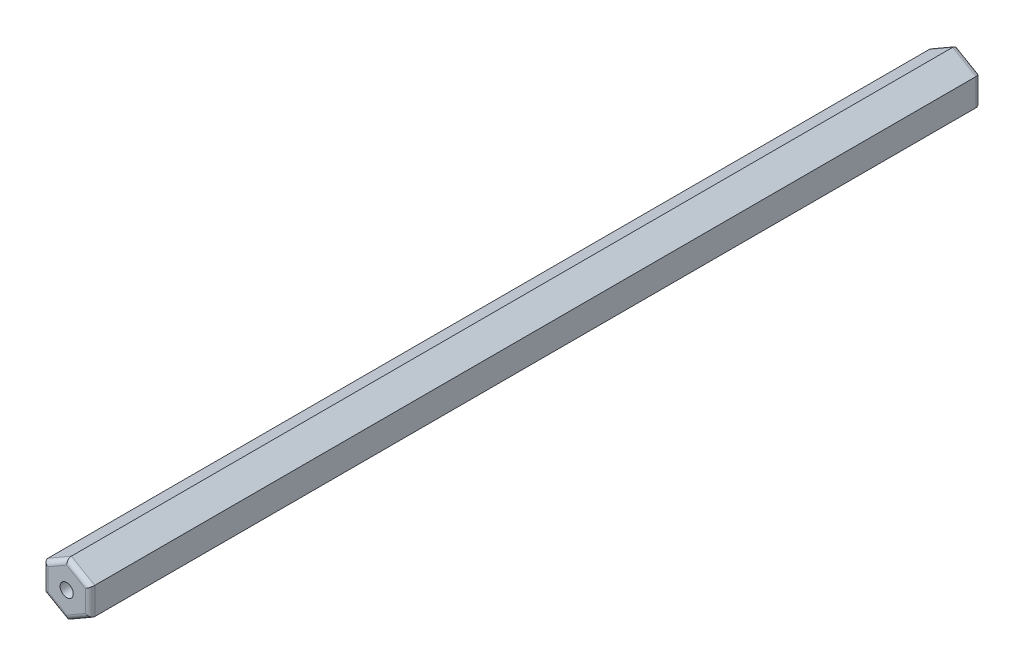
ISO-10303-21;
HEADER;
FILE_DESCRIPTION(('STEP AP214'),'2;1');
FILE_NAME('part.step','',(''),(''),'','','');
FILE_SCHEMA(('AUTOMOTIVE_DESIGN { 1 0 10303 214 1 1 1 1 }'));
ENDSEC;
DATA;
#1=APPLICATION_CONTEXT('core data for automotive mechanical design processes');
#2=APPLICATION_PROTOCOL_DEFINITION('international standard','automotive_design',2000,#1);
#3=PRODUCT_CONTEXT('',#1,'mechanical');
#4=PRODUCT('Part','Part','',(#3));
#5=PRODUCT_RELATED_PRODUCT_CATEGORY('part','',(#4));
#6=PRODUCT_DEFINITION_FORMATION('','',#4);
#7=PRODUCT_DEFINITION_CONTEXT('part definition',#1,'design');
#8=PRODUCT_DEFINITION('design','',#6,#7);
#9=PRODUCT_DEFINITION_SHAPE('','',#8);
#10=(LENGTH_UNIT() NAMED_UNIT(*) SI_UNIT(.MILLI.,.METRE.));
#11=(NAMED_UNIT(*) PLANE_ANGLE_UNIT() SI_UNIT($,.RADIAN.));
#12=(NAMED_UNIT(*) SI_UNIT($,.STERADIAN.) SOLID_ANGLE_UNIT());
#13=UNCERTAINTY_MEASURE_WITH_UNIT(LENGTH_MEASURE(1.E-05),#10,'distance_accuracy_value','');
#14=(GEOMETRIC_REPRESENTATION_CONTEXT(3) GLOBAL_UNCERTAINTY_ASSIGNED_CONTEXT((#13)) GLOBAL_UNIT_ASSIGNED_CONTEXT((#10,
#11,#12)) REPRESENTATION_CONTEXT('',''));
#15=CARTESIAN_POINT('',(0.,0.,0.));
#16=DIRECTION('',(0.,0.,1.));
#17=DIRECTION('',(1.,0.,0.));
#18=AXIS2_PLACEMENT_3D('',#15,#16,#17);
#19=CARTESIAN_POINT('',(-52.50212267549,1.44337567297407,40.));
#20=DIRECTION('',(0.5,0.866025403784439,0.));
#21=DIRECTION('',(-0.866025403784439,0.5,0.));
#22=AXIS2_PLACEMENT_3D('',#19,#20,#21);
#23=PLANE('',#22);
#24=DIRECTION('',(0.,0.,1.));
#25=VECTOR('',#24,1.);
#26=CARTESIAN_POINT('',(-55.00212267549,2.88675134594813,40.));
#27=LINE('',#26,#25);
#28=CARTESIAN_POINT('',(-55.00212267549,2.88675134594813,40.5));
#29=VERTEX_POINT('',#28);
#30=CARTESIAN_POINT('',(-55.00212267549,2.88675134594813,134.5));
#31=VERTEX_POINT('',#30);
#32=EDGE_CURVE('E157',#29,#31,#27,.T.);
#33=ORIENTED_EDGE('',*,*,#32,.T.);
#34=DIRECTION('',(-0.866025403784439,0.5,0.));
#35=VECTOR('',#34,1.);
#36=CARTESIAN_POINT('',(-52.50212267549,1.44337567297407,134.5));
#37=LINE('',#36,#35);
#38=CARTESIAN_POINT('',(-52.50212267549,1.44337567297407,134.5));
#39=VERTEX_POINT('',#38);
#40=EDGE_CURVE('E154',#31,#39,#37,.F.);
#41=ORIENTED_EDGE('',*,*,#40,.T.);
#42=DIRECTION('',(0.,0.,1.));
#43=VECTOR('',#42,1.);
#44=CARTESIAN_POINT('',(-52.50212267549,1.44337567297407,40.));
#45=LINE('',#44,#43);
#46=CARTESIAN_POINT('',(-52.50212267549,1.44337567297407,40.5));
#47=VERTEX_POINT('',#46);
#48=EDGE_CURVE('E151',#47,#39,#45,.T.);
#49=ORIENTED_EDGE('',*,*,#48,.F.);
#50=DIRECTION('',(-0.866025403784439,0.5,0.));
#51=VECTOR('',#50,1.);
#52=CARTESIAN_POINT('',(-55.00212267549,2.88675134594813,40.5));
#53=LINE('',#52,#51);
#54=EDGE_CURVE('E211',#47,#29,#53,.T.);
#55=ORIENTED_EDGE('',*,*,#54,.T.);
#56=EDGE_LOOP('',(#33,#41,#49,#55));
#57=FACE_BOUND('',#56,.T.);
#58=ADVANCED_FACE('F37',(#57),#23,.T.);
#59=CARTESIAN_POINT('',(-52.50212267549,-1.44337567297408,40.));
#60=DIRECTION('',(1.,0.,0.));
#61=DIRECTION('',(0.,0.,-1.));
#62=AXIS2_PLACEMENT_3D('',#59,#60,#61);
#63=PLANE('',#62);
#64=ORIENTED_EDGE('',*,*,#48,.T.);
#65=DIRECTION('',(0.,1.,0.));
#66=VECTOR('',#65,1.);
#67=CARTESIAN_POINT('',(-52.50212267549,-1.44337567297408,134.5));
#68=LINE('',#67,#66);
#69=CARTESIAN_POINT('',(-52.50212267549,-1.44337567297408,134.5));
#70=VERTEX_POINT('',#69);
#71=EDGE_CURVE('E196',#39,#70,#68,.F.);
#72=ORIENTED_EDGE('',*,*,#71,.T.);
#73=DIRECTION('',(0.,0.,1.));
#74=VECTOR('',#73,1.);
#75=CARTESIAN_POINT('',(-52.50212267549,-1.44337567297408,40.));
#76=LINE('',#75,#74);
#77=CARTESIAN_POINT('',(-52.50212267549,-1.44337567297408,40.5));
#78=VERTEX_POINT('',#77);
#79=EDGE_CURVE('E260',#78,#70,#76,.T.);
#80=ORIENTED_EDGE('',*,*,#79,.F.);
#81=DIRECTION('',(0.,1.,0.));
#82=VECTOR('',#81,1.);
#83=CARTESIAN_POINT('',(-52.50212267549,1.44337567297407,40.5));
#84=LINE('',#83,#82);
#85=EDGE_CURVE('E202',#78,#47,#84,.T.);
#86=ORIENTED_EDGE('',*,*,#85,.T.);
#87=EDGE_LOOP('',(#64,#72,#80,#86));
#88=FACE_BOUND('',#87,.T.);
#89=ADVANCED_FACE('F289',(#88),#63,.T.);
#90=CARTESIAN_POINT('',(-55.00212267549,-2.88675134594813,40.));
#91=DIRECTION('',(0.5,-0.866025403784439,0.));
#92=DIRECTION('',(0.866025403784439,0.5,0.));
#93=AXIS2_PLACEMENT_3D('',#90,#91,#92);
#94=PLANE('',#93);
#95=ORIENTED_EDGE('',*,*,#79,.T.);
#96=DIRECTION('',(0.866025403784439,0.5,0.));
#97=VECTOR('',#96,1.);
#98=CARTESIAN_POINT('',(-55.00212267549,-2.88675134594813,134.5));
#99=LINE('',#98,#97);
#100=CARTESIAN_POINT('',(-55.00212267549,-2.88675134594813,134.5));
#101=VERTEX_POINT('',#100);
#102=EDGE_CURVE('E236',#70,#101,#99,.F.);
#103=ORIENTED_EDGE('',*,*,#102,.T.);
#104=DIRECTION('',(0.,0.,1.));
#105=VECTOR('',#104,1.);
#106=CARTESIAN_POINT('',(-55.00212267549,-2.88675134594813,40.));
#107=LINE('',#106,#105);
#108=CARTESIAN_POINT('',(-55.00212267549,-2.88675134594813,40.5));
#109=VERTEX_POINT('',#108);
#110=EDGE_CURVE('E258',#109,#101,#107,.T.);
#111=ORIENTED_EDGE('',*,*,#110,.F.);
#112=DIRECTION('',(0.866025403784439,0.5,0.));
#113=VECTOR('',#112,1.);
#114=CARTESIAN_POINT('',(-52.50212267549,-1.44337567297408,40.5));
#115=LINE('',#114,#113);
#116=EDGE_CURVE('E239',#109,#78,#115,.T.);
#117=ORIENTED_EDGE('',*,*,#116,.T.);
#118=EDGE_LOOP('',(#95,#103,#111,#117));
#119=FACE_BOUND('',#118,.T.);
#120=ADVANCED_FACE('F295',(#119),#94,.T.);
#121=CARTESIAN_POINT('',(-57.50212267549,-1.44337567297406,40.));
#122=DIRECTION('',(-0.5,-0.866025403784438,0.));
#123=DIRECTION('',(0.866025403784438,-0.5,0.));
#124=AXIS2_PLACEMENT_3D('',#121,#122,#123);
#125=PLANE('',#124);
#126=ORIENTED_EDGE('',*,*,#110,.T.);
#127=DIRECTION('',(0.866025403784438,-0.5,0.));
#128=VECTOR('',#127,1.);
#129=CARTESIAN_POINT('',(-57.50212267549,-1.44337567297406,134.5));
#130=LINE('',#129,#128);
#131=CARTESIAN_POINT('',(-57.50212267549,-1.44337567297406,134.5));
#132=VERTEX_POINT('',#131);
#133=EDGE_CURVE('E206',#101,#132,#130,.F.);
#134=ORIENTED_EDGE('',*,*,#133,.T.);
#135=DIRECTION('',(0.,0.,1.));
#136=VECTOR('',#135,1.);
#137=CARTESIAN_POINT('',(-57.50212267549,-1.44337567297406,40.));
#138=LINE('',#137,#136);
#139=CARTESIAN_POINT('',(-57.50212267549,-1.44337567297406,40.5));
#140=VERTEX_POINT('',#139);
#141=EDGE_CURVE('E255',#140,#132,#138,.T.);
#142=ORIENTED_EDGE('',*,*,#141,.F.);
#143=DIRECTION('',(0.866025403784438,-0.5,0.));
#144=VECTOR('',#143,1.);
#145=CARTESIAN_POINT('',(-55.00212267549,-2.88675134594813,40.5));
#146=LINE('',#145,#144);
#147=EDGE_CURVE('E231',#140,#109,#146,.T.);
#148=ORIENTED_EDGE('',*,*,#147,.T.);
#149=EDGE_LOOP('',(#126,#134,#142,#148));
#150=FACE_BOUND('',#149,.T.);
#151=ADVANCED_FACE('F344',(#150),#125,.T.);
#152=CARTESIAN_POINT('',(-57.50212267549,1.44337567297406,40.));
#153=DIRECTION('',(-1.,0.,0.));
#154=DIRECTION('',(0.,0.,1.));
#155=AXIS2_PLACEMENT_3D('',#152,#153,#154);
#156=PLANE('',#155);
#157=ORIENTED_EDGE('',*,*,#141,.T.);
#158=DIRECTION('',(0.,-1.,0.));
#159=VECTOR('',#158,1.);
#160=CARTESIAN_POINT('',(-57.50212267549,1.44337567297406,134.5));
#161=LINE('',#160,#159);
#162=CARTESIAN_POINT('',(-57.50212267549,1.44337567297406,134.5));
#163=VERTEX_POINT('',#162);
#164=EDGE_CURVE('E204',#132,#163,#161,.F.);
#165=ORIENTED_EDGE('',*,*,#164,.T.);
#166=DIRECTION('',(0.,0.,1.));
#167=VECTOR('',#166,1.);
#168=CARTESIAN_POINT('',(-57.50212267549,1.44337567297406,40.));
#169=LINE('',#168,#167);
#170=CARTESIAN_POINT('',(-57.50212267549,1.44337567297406,40.5));
#171=VERTEX_POINT('',#170);
#172=EDGE_CURVE('E252',#171,#163,#169,.T.);
#173=ORIENTED_EDGE('',*,*,#172,.F.);
#174=DIRECTION('',(0.,-1.,0.));
#175=VECTOR('',#174,1.);
#176=CARTESIAN_POINT('',(-57.50212267549,-1.44337567297406,40.5));
#177=LINE('',#176,#175);
#178=EDGE_CURVE('E201',#171,#140,#177,.T.);
#179=ORIENTED_EDGE('',*,*,#178,.T.);
#180=EDGE_LOOP('',(#157,#165,#173,#179));
#181=FACE_BOUND('',#180,.T.);
#182=ADVANCED_FACE('F346',(#181),#156,.T.);
#183=CARTESIAN_POINT('',(-55.00212267549,2.88675134594813,40.));
#184=DIRECTION('',(-0.5,0.866025403784439,0.));
#185=DIRECTION('',(-0.866025403784439,-0.5,0.));
#186=AXIS2_PLACEMENT_3D('',#183,#184,#185);
#187=PLANE('',#186);
#188=ORIENTED_EDGE('',*,*,#172,.T.);
#189=DIRECTION('',(-0.866025403784439,-0.5,0.));
#190=VECTOR('',#189,1.);
#191=CARTESIAN_POINT('',(-55.00212267549,2.88675134594813,134.5));
#192=LINE('',#191,#190);
#193=EDGE_CURVE('E216',#163,#31,#192,.F.);
#194=ORIENTED_EDGE('',*,*,#193,.T.);
#195=ORIENTED_EDGE('',*,*,#32,.F.);
#196=DIRECTION('',(-0.866025403784439,-0.5,0.));
#197=VECTOR('',#196,1.);
#198=CARTESIAN_POINT('',(-57.50212267549,1.44337567297406,40.5));
#199=LINE('',#198,#197);
#200=EDGE_CURVE('E214',#29,#171,#199,.T.);
#201=ORIENTED_EDGE('',*,*,#200,.T.);
#202=EDGE_LOOP('',(#188,#194,#195,#201));
#203=FACE_BOUND('',#202,.T.);
#204=ADVANCED_FACE('F285',(#203),#187,.T.);
#205=CARTESIAN_POINT('',(0.,0.,40.));
#206=DIRECTION('',(0.,0.,1.));
#207=DIRECTION('',(1.,0.,0.));
#208=AXIS2_PLACEMENT_3D('',#205,#206,#207);
#209=PLANE('',#208);
#210=CARTESIAN_POINT('',(-55.00212267549,0.,40.));
#211=DIRECTION('',(0.,0.,1.));
#212=DIRECTION('',(1.,0.,0.));
#213=AXIS2_PLACEMENT_3D('',#210,#211,#212);
#214=CIRCLE('',#213,0.701481341004905);
#215=CARTESIAN_POINT('',(-54.3006413344851,0.,40.));
#216=VERTEX_POINT('',#215);
#217=EDGE_CURVE('E166',#216,#216,#214,.T.);
#218=ORIENTED_EDGE('',*,*,#217,.T.);
#219=EDGE_LOOP('',(#218));
#220=FACE_BOUND('',#219,.T.);
#221=DIRECTION('',(0.,1.,0.));
#222=VECTOR('',#221,1.);
#223=CARTESIAN_POINT('',(-53.00212267549,-1.44337567297408,40.));
#224=LINE('',#223,#222);
#225=CARTESIAN_POINT('',(-53.00212267549,1.15470053837925,40.));
#226=VERTEX_POINT('',#225);
#227=CARTESIAN_POINT('',(-53.00212267549,-1.15470053837926,40.));
#228=VERTEX_POINT('',#227);
#229=EDGE_CURVE('E61',#226,#228,#224,.F.);
#230=ORIENTED_EDGE('',*,*,#229,.T.);
#231=DIRECTION('',(0.866025403784439,0.5,0.));
#232=VECTOR('',#231,1.);
#233=CARTESIAN_POINT('',(-55.25212267549,-2.45373864405591,40.));
#234=LINE('',#233,#232);
#235=CARTESIAN_POINT('',(-55.00212267549,-2.30940107675851,40.));
#236=VERTEX_POINT('',#235);
#237=EDGE_CURVE('E11',#228,#236,#234,.F.);
#238=ORIENTED_EDGE('',*,*,#237,.T.);
#239=DIRECTION('',(0.866025403784438,-0.5,0.));
#240=VECTOR('',#239,1.);
#241=CARTESIAN_POINT('',(-57.25212267549,-1.01036297108184,40.));
#242=LINE('',#241,#240);
#243=CARTESIAN_POINT('',(-57.00212267549,-1.15470053837925,40.));
#244=VERTEX_POINT('',#243);
#245=EDGE_CURVE('E46',#236,#244,#242,.F.);
#246=ORIENTED_EDGE('',*,*,#245,.T.);
#247=DIRECTION('',(0.,-1.,0.));
#248=VECTOR('',#247,1.);
#249=CARTESIAN_POINT('',(-57.00212267549,1.44337567297406,40.));
#250=LINE('',#249,#248);
#251=CARTESIAN_POINT('',(-57.00212267549,1.15470053837925,40.));
#252=VERTEX_POINT('',#251);
#253=EDGE_CURVE('E222',#244,#252,#250,.F.);
#254=ORIENTED_EDGE('',*,*,#253,.T.);
#255=DIRECTION('',(-0.866025403784439,-0.5,0.));
#256=VECTOR('',#255,1.);
#257=CARTESIAN_POINT('',(-54.75212267549,2.45373864405591,40.));
#258=LINE('',#257,#256);
#259=CARTESIAN_POINT('',(-55.00212267549,2.3094010767585,40.));
#260=VERTEX_POINT('',#259);
#261=EDGE_CURVE('E218',#252,#260,#258,.F.);
#262=ORIENTED_EDGE('',*,*,#261,.T.);
#263=DIRECTION('',(-0.866025403784439,0.5,0.));
#264=VECTOR('',#263,1.);
#265=CARTESIAN_POINT('',(-52.75212267549,1.01036297108185,40.));
#266=LINE('',#265,#264);
#267=EDGE_CURVE('E220',#260,#226,#266,.F.);
#268=ORIENTED_EDGE('',*,*,#267,.T.);
#269=EDGE_LOOP('',(#230,#238,#246,#254,#262,#268));
#270=FACE_BOUND('',#269,.T.);
#271=ADVANCED_FACE('F224',(#220,#270),#209,.F.);
#272=CARTESIAN_POINT('',(0.,0.,135.));
#273=DIRECTION('',(0.,0.,1.));
#274=DIRECTION('',(1.,0.,0.));
#275=AXIS2_PLACEMENT_3D('',#272,#273,#274);
#276=PLANE('',#275);
#277=CARTESIAN_POINT('',(-55.00212267549,0.,135.));
#278=DIRECTION('',(0.,0.,1.));
#279=DIRECTION('',(1.,0.,0.));
#280=AXIS2_PLACEMENT_3D('',#277,#278,#279);
#281=CIRCLE('',#280,0.701481341004905);
#282=CARTESIAN_POINT('',(-54.3006413344851,0.,135.));
#283=VERTEX_POINT('',#282);
#284=EDGE_CURVE('E263',#283,#283,#281,.T.);
#285=ORIENTED_EDGE('',*,*,#284,.F.);
#286=EDGE_LOOP('',(#285));
#287=FACE_BOUND('',#286,.T.);
#288=DIRECTION('',(0.866025403784438,-0.5,0.));
#289=VECTOR('',#288,1.);
#290=CARTESIAN_POINT('',(-14.7505306688725,-25.5486685570901,135.));
#291=LINE('',#290,#289);
#292=CARTESIAN_POINT('',(-57.00212267549,-1.15470053837925,135.));
#293=VERTEX_POINT('',#292);
#294=CARTESIAN_POINT('',(-55.00212267549,-2.30940107675851,135.));
#295=VERTEX_POINT('',#294);
#296=EDGE_CURVE('E246',#293,#295,#291,.T.);
#297=ORIENTED_EDGE('',*,*,#296,.T.);
#298=DIRECTION('',(0.866025403784439,0.5,0.));
#299=VECTOR('',#298,1.);
#300=CARTESIAN_POINT('',(-12.7505306688725,22.0845669419523,135.));
#301=LINE('',#300,#299);
#302=CARTESIAN_POINT('',(-53.00212267549,-1.15470053837927,135.));
#303=VERTEX_POINT('',#302);
#304=EDGE_CURVE('E244',#295,#303,#301,.T.);
#305=ORIENTED_EDGE('',*,*,#304,.T.);
#306=DIRECTION('',(0.,1.,0.));
#307=VECTOR('',#306,1.);
#308=CARTESIAN_POINT('',(-53.00212267549,0.,135.));
#309=LINE('',#308,#307);
#310=CARTESIAN_POINT('',(-53.00212267549,1.15470053837925,135.));
#311=VERTEX_POINT('',#310);
#312=EDGE_CURVE('E135',#303,#311,#309,.T.);
#313=ORIENTED_EDGE('',*,*,#312,.T.);
#314=DIRECTION('',(-0.866025403784439,0.5,0.));
#315=VECTOR('',#314,1.);
#316=CARTESIAN_POINT('',(-12.7505306688725,-22.0845669419524,135.));
#317=LINE('',#316,#315);
#318=CARTESIAN_POINT('',(-55.00212267549,2.3094010767585,135.));
#319=VERTEX_POINT('',#318);
#320=EDGE_CURVE('E128',#311,#319,#317,.T.);
#321=ORIENTED_EDGE('',*,*,#320,.T.);
#322=DIRECTION('',(-0.866025403784439,-0.5,0.));
#323=VECTOR('',#322,1.);
#324=CARTESIAN_POINT('',(-14.7505306688725,25.5486685570901,135.));
#325=LINE('',#324,#323);
#326=CARTESIAN_POINT('',(-57.00212267549,1.15470053837925,135.));
#327=VERTEX_POINT('',#326);
#328=EDGE_CURVE('E131',#319,#327,#325,.T.);
#329=ORIENTED_EDGE('',*,*,#328,.T.);
#330=DIRECTION('',(0.,-1.,0.));
#331=VECTOR('',#330,1.);
#332=CARTESIAN_POINT('',(-57.00212267549,0.,135.));
#333=LINE('',#332,#331);
#334=EDGE_CURVE('E140',#327,#293,#333,.T.);
#335=ORIENTED_EDGE('',*,*,#334,.T.);
#336=EDGE_LOOP('',(#297,#305,#313,#321,#329,#335));
#337=FACE_BOUND('',#336,.T.);
#338=ADVANCED_FACE('F130',(#287,#337),#276,.T.);
#339=CARTESIAN_POINT('',(-14.7505306688725,25.5486685570901,134.5));
#340=DIRECTION('',(-0.866025403784439,-0.5,0.));
#341=DIRECTION('',(0.5,-0.866025403784439,0.));
#342=AXIS2_PLACEMENT_3D('',#339,#340,#341);
#343=CYLINDRICAL_SURFACE('',#342,0.5);
#344=CARTESIAN_POINT('',(-55.00212267549,2.3094010767585,134.5));
#345=DIRECTION('',(-1.,0.,0.));
#346=DIRECTION('',(0.,-1.,0.));
#347=AXIS2_PLACEMENT_3D('',#344,#345,#346);
#348=ELLIPSE('',#347,0.577350269189626,0.5);
#349=EDGE_CURVE('E146',#31,#319,#348,.F.);
#350=ORIENTED_EDGE('',*,*,#349,.F.);
#351=ORIENTED_EDGE('',*,*,#193,.F.);
#352=CARTESIAN_POINT('',(-57.00212267549,1.15470053837925,134.5));
#353=DIRECTION('',(-0.5,-0.866025403784439,0.));
#354=DIRECTION('',(-0.866025403784439,0.5,0.));
#355=AXIS2_PLACEMENT_3D('',#352,#353,#354);
#356=ELLIPSE('',#355,0.577350269189626,0.5);
#357=EDGE_CURVE('E149',#327,#163,#356,.T.);
#358=ORIENTED_EDGE('',*,*,#357,.F.);
#359=ORIENTED_EDGE('',*,*,#328,.F.);
#360=EDGE_LOOP('',(#350,#351,#358,#359));
#361=FACE_BOUND('',#360,.T.);
#362=ADVANCED_FACE('F144',(#361),#343,.T.);
#363=CARTESIAN_POINT('',(-57.00212267549,0.,134.5));
#364=DIRECTION('',(0.,-1.,0.));
#365=DIRECTION('',(0.,0.,-1.));
#366=AXIS2_PLACEMENT_3D('',#363,#364,#365);
#367=CYLINDRICAL_SURFACE('',#366,0.5);
#368=ORIENTED_EDGE('',*,*,#357,.T.);
#369=ORIENTED_EDGE('',*,*,#164,.F.);
#370=CARTESIAN_POINT('',(-57.00212267549,-1.15470053837925,134.5));
#371=DIRECTION('',(0.5,-0.866025403784439,0.));
#372=DIRECTION('',(-0.866025403784439,-0.5,0.));
#373=AXIS2_PLACEMENT_3D('',#370,#371,#372);
#374=ELLIPSE('',#373,0.577350269189626,0.5);
#375=EDGE_CURVE('E155',#293,#132,#374,.T.);
#376=ORIENTED_EDGE('',*,*,#375,.F.);
#377=ORIENTED_EDGE('',*,*,#334,.F.);
#378=EDGE_LOOP('',(#368,#369,#376,#377));
#379=FACE_BOUND('',#378,.T.);
#380=ADVANCED_FACE('F283',(#379),#367,.T.);
#381=CARTESIAN_POINT('',(-12.7505306688725,-22.0845669419524,134.5));
#382=DIRECTION('',(-0.866025403784439,0.5,0.));
#383=DIRECTION('',(-0.5,-0.866025403784439,0.));
#384=AXIS2_PLACEMENT_3D('',#381,#382,#383);
#385=CYLINDRICAL_SURFACE('',#384,0.5);
#386=ORIENTED_EDGE('',*,*,#349,.T.);
#387=ORIENTED_EDGE('',*,*,#320,.F.);
#388=CARTESIAN_POINT('',(-53.00212267549,1.15470053837925,134.5));
#389=DIRECTION('',(-0.5,0.866025403784439,0.));
#390=DIRECTION('',(-0.866025403784439,-0.5,0.));
#391=AXIS2_PLACEMENT_3D('',#388,#389,#390);
#392=ELLIPSE('',#391,0.577350269189626,0.5);
#393=EDGE_CURVE('E160',#39,#311,#392,.F.);
#394=ORIENTED_EDGE('',*,*,#393,.F.);
#395=ORIENTED_EDGE('',*,*,#40,.F.);
#396=EDGE_LOOP('',(#386,#387,#394,#395));
#397=FACE_BOUND('',#396,.T.);
#398=ADVANCED_FACE('F153',(#397),#385,.T.);
#399=CARTESIAN_POINT('',(-14.7505306688725,-25.5486685570901,134.5));
#400=DIRECTION('',(0.866025403784438,-0.5,0.));
#401=DIRECTION('',(0.5,0.866025403784438,0.));
#402=AXIS2_PLACEMENT_3D('',#399,#400,#401);
#403=CYLINDRICAL_SURFACE('',#402,0.5);
#404=ORIENTED_EDGE('',*,*,#375,.T.);
#405=ORIENTED_EDGE('',*,*,#133,.F.);
#406=CARTESIAN_POINT('',(-55.00212267549,-2.30940107675851,134.5));
#407=DIRECTION('',(1.,0.,0.));
#408=DIRECTION('',(0.,-1.,0.));
#409=AXIS2_PLACEMENT_3D('',#406,#407,#408);
#410=ELLIPSE('',#409,0.577350269189626,0.5);
#411=EDGE_CURVE('E185',#295,#101,#410,.T.);
#412=ORIENTED_EDGE('',*,*,#411,.F.);
#413=ORIENTED_EDGE('',*,*,#296,.F.);
#414=EDGE_LOOP('',(#404,#405,#412,#413));
#415=FACE_BOUND('',#414,.T.);
#416=ADVANCED_FACE('F304',(#415),#403,.T.);
#417=CARTESIAN_POINT('',(-53.00212267549,0.,134.5));
#418=DIRECTION('',(0.,1.,0.));
#419=DIRECTION('',(0.,0.,1.));
#420=AXIS2_PLACEMENT_3D('',#417,#418,#419);
#421=CYLINDRICAL_SURFACE('',#420,0.5);
#422=ORIENTED_EDGE('',*,*,#393,.T.);
#423=ORIENTED_EDGE('',*,*,#312,.F.);
#424=CARTESIAN_POINT('',(-53.00212267549,-1.15470053837927,134.5));
#425=DIRECTION('',(0.5,0.866025403784438,0.));
#426=DIRECTION('',(-0.866025403784438,0.5,0.));
#427=AXIS2_PLACEMENT_3D('',#424,#425,#426);
#428=ELLIPSE('',#427,0.577350269189626,0.5);
#429=EDGE_CURVE('E180',#70,#303,#428,.F.);
#430=ORIENTED_EDGE('',*,*,#429,.F.);
#431=ORIENTED_EDGE('',*,*,#71,.F.);
#432=EDGE_LOOP('',(#422,#423,#430,#431));
#433=FACE_BOUND('',#432,.T.);
#434=ADVANCED_FACE('F195',(#433),#421,.T.);
#435=CARTESIAN_POINT('',(-12.7505306688725,22.0845669419523,134.5));
#436=DIRECTION('',(0.866025403784439,0.5,0.));
#437=DIRECTION('',(-0.5,0.866025403784439,0.));
#438=AXIS2_PLACEMENT_3D('',#435,#436,#437);
#439=CYLINDRICAL_SURFACE('',#438,0.5);
#440=ORIENTED_EDGE('',*,*,#411,.T.);
#441=ORIENTED_EDGE('',*,*,#102,.F.);
#442=ORIENTED_EDGE('',*,*,#429,.T.);
#443=ORIENTED_EDGE('',*,*,#304,.F.);
#444=EDGE_LOOP('',(#440,#441,#442,#443));
#445=FACE_BOUND('',#444,.T.);
#446=ADVANCED_FACE('F299',(#445),#439,.T.);
#447=CARTESIAN_POINT('',(-54.75212267549,2.45373864405591,40.5));
#448=DIRECTION('',(0.866025403784439,0.5,0.));
#449=DIRECTION('',(-0.5,0.866025403784439,0.));
#450=AXIS2_PLACEMENT_3D('',#447,#448,#449);
#451=CYLINDRICAL_SURFACE('',#450,0.5);
#452=CARTESIAN_POINT('',(-55.00212267549,2.3094010767585,40.5));
#453=DIRECTION('',(1.,0.,0.));
#454=DIRECTION('',(0.,1.,0.));
#455=AXIS2_PLACEMENT_3D('',#452,#453,#454);
#456=ELLIPSE('',#455,0.577350269189626,0.5);
#457=EDGE_CURVE('E173',#260,#29,#456,.T.);
#458=ORIENTED_EDGE('',*,*,#457,.F.);
#459=ORIENTED_EDGE('',*,*,#261,.F.);
#460=CARTESIAN_POINT('',(-57.00212267549,1.15470053837925,40.5));
#461=DIRECTION('',(0.5,0.866025403784439,0.));
#462=DIRECTION('',(0.866025403784439,-0.5,0.));
#463=AXIS2_PLACEMENT_3D('',#460,#461,#462);
#464=ELLIPSE('',#463,0.577350269189626,0.5);
#465=EDGE_CURVE('E41',#171,#252,#464,.F.);
#466=ORIENTED_EDGE('',*,*,#465,.F.);
#467=ORIENTED_EDGE('',*,*,#200,.F.);
#468=EDGE_LOOP('',(#458,#459,#466,#467));
#469=FACE_BOUND('',#468,.T.);
#470=ADVANCED_FACE('F39',(#469),#451,.T.);
#471=CARTESIAN_POINT('',(-57.00212267549,1.44337567297406,40.5));
#472=DIRECTION('',(0.,1.,0.));
#473=DIRECTION('',(0.,0.,1.));
#474=AXIS2_PLACEMENT_3D('',#471,#472,#473);
#475=CYLINDRICAL_SURFACE('',#474,0.5);
#476=ORIENTED_EDGE('',*,*,#465,.T.);
#477=ORIENTED_EDGE('',*,*,#253,.F.);
#478=CARTESIAN_POINT('',(-57.00212267549,-1.15470053837925,40.5));
#479=DIRECTION('',(-0.5,0.866025403784439,0.));
#480=DIRECTION('',(0.866025403784439,0.5,0.));
#481=AXIS2_PLACEMENT_3D('',#478,#479,#480);
#482=ELLIPSE('',#481,0.577350269189626,0.5);
#483=EDGE_CURVE('E171',#140,#244,#482,.F.);
#484=ORIENTED_EDGE('',*,*,#483,.F.);
#485=ORIENTED_EDGE('',*,*,#178,.F.);
#486=EDGE_LOOP('',(#476,#477,#484,#485));
#487=FACE_BOUND('',#486,.T.);
#488=ADVANCED_FACE('F228',(#487),#475,.T.);
#489=CARTESIAN_POINT('',(-52.75212267549,1.01036297108185,40.5));
#490=DIRECTION('',(0.866025403784439,-0.5,0.));
#491=DIRECTION('',(0.5,0.866025403784439,0.));
#492=AXIS2_PLACEMENT_3D('',#489,#490,#491);
#493=CYLINDRICAL_SURFACE('',#492,0.5);
#494=ORIENTED_EDGE('',*,*,#457,.T.);
#495=ORIENTED_EDGE('',*,*,#54,.F.);
#496=CARTESIAN_POINT('',(-53.00212267549,1.15470053837925,40.5));
#497=DIRECTION('',(0.5,-0.866025403784439,0.));
#498=DIRECTION('',(0.866025403784439,0.5,0.));
#499=AXIS2_PLACEMENT_3D('',#496,#497,#498);
#500=ELLIPSE('',#499,0.577350269189626,0.5);
#501=EDGE_CURVE('E168',#226,#47,#500,.T.);
#502=ORIENTED_EDGE('',*,*,#501,.F.);
#503=ORIENTED_EDGE('',*,*,#267,.F.);
#504=EDGE_LOOP('',(#494,#495,#502,#503));
#505=FACE_BOUND('',#504,.T.);
#506=ADVANCED_FACE('F321',(#505),#493,.T.);
#507=CARTESIAN_POINT('',(-57.25212267549,-1.01036297108184,40.5));
#508=DIRECTION('',(-0.866025403784438,0.5,0.));
#509=DIRECTION('',(-0.5,-0.866025403784438,0.));
#510=AXIS2_PLACEMENT_3D('',#507,#508,#509);
#511=CYLINDRICAL_SURFACE('',#510,0.5);
#512=ORIENTED_EDGE('',*,*,#483,.T.);
#513=ORIENTED_EDGE('',*,*,#245,.F.);
#514=CARTESIAN_POINT('',(-55.00212267549,-2.30940107675851,40.5));
#515=DIRECTION('',(-1.,0.,0.));
#516=DIRECTION('',(0.,1.,0.));
#517=AXIS2_PLACEMENT_3D('',#514,#515,#516);
#518=ELLIPSE('',#517,0.577350269189626,0.5);
#519=EDGE_CURVE('E54',#109,#236,#518,.F.);
#520=ORIENTED_EDGE('',*,*,#519,.F.);
#521=ORIENTED_EDGE('',*,*,#147,.F.);
#522=EDGE_LOOP('',(#512,#513,#520,#521));
#523=FACE_BOUND('',#522,.T.);
#524=ADVANCED_FACE('F230',(#523),#511,.T.);
#525=CARTESIAN_POINT('',(-53.00212267549,-1.44337567297408,40.5));
#526=DIRECTION('',(0.,-1.,0.));
#527=DIRECTION('',(0.,0.,-1.));
#528=AXIS2_PLACEMENT_3D('',#525,#526,#527);
#529=CYLINDRICAL_SURFACE('',#528,0.5);
#530=ORIENTED_EDGE('',*,*,#501,.T.);
#531=ORIENTED_EDGE('',*,*,#85,.F.);
#532=CARTESIAN_POINT('',(-53.00212267549,-1.15470053837926,40.5));
#533=DIRECTION('',(-0.5,-0.866025403784438,0.));
#534=DIRECTION('',(0.866025403784438,-0.5,0.));
#535=AXIS2_PLACEMENT_3D('',#532,#533,#534);
#536=ELLIPSE('',#535,0.577350269189626,0.5);
#537=EDGE_CURVE('E164',#228,#78,#536,.T.);
#538=ORIENTED_EDGE('',*,*,#537,.F.);
#539=ORIENTED_EDGE('',*,*,#229,.F.);
#540=EDGE_LOOP('',(#530,#531,#538,#539));
#541=FACE_BOUND('',#540,.T.);
#542=ADVANCED_FACE('F315',(#541),#529,.T.);
#543=CARTESIAN_POINT('',(-55.25212267549,-2.45373864405591,40.5));
#544=DIRECTION('',(-0.866025403784439,-0.5,0.));
#545=DIRECTION('',(0.5,-0.866025403784439,0.));
#546=AXIS2_PLACEMENT_3D('',#543,#544,#545);
#547=CYLINDRICAL_SURFACE('',#546,0.5);
#548=ORIENTED_EDGE('',*,*,#519,.T.);
#549=ORIENTED_EDGE('',*,*,#237,.F.);
#550=ORIENTED_EDGE('',*,*,#537,.T.);
#551=ORIENTED_EDGE('',*,*,#116,.F.);
#552=EDGE_LOOP('',(#548,#549,#550,#551));
#553=FACE_BOUND('',#552,.T.);
#554=ADVANCED_FACE('F273',(#553),#547,.T.);
#555=CARTESIAN_POINT('',(-55.00212267549,0.,40.));
#556=DIRECTION('',(0.,0.,1.));
#557=DIRECTION('',(1.,0.,0.));
#558=AXIS2_PLACEMENT_3D('',#555,#556,#557);
#559=CYLINDRICAL_SURFACE('',#558,0.701481341004905);
#560=ORIENTED_EDGE('',*,*,#217,.F.);
#561=EDGE_LOOP('',(#560));
#562=FACE_BOUND('',#561,.T.);
#563=ORIENTED_EDGE('',*,*,#284,.T.);
#564=EDGE_LOOP('',(#563));
#565=FACE_BOUND('',#564,.T.);
#566=ADVANCED_FACE('F270',(#562,#565),#559,.F.);
#567=CLOSED_SHELL('',(#58,#89,#120,#151,#182,#204,#271,#338,#362,#380,#398,#416,#434,#446,#470,
#488,#506,#524,#542,#554,#566));
#568=MANIFOLD_SOLID_BREP('B2',#567);
#569=ADVANCED_BREP_SHAPE_REPRESENTATION('',(#18,#568),#14);
#570=SHAPE_DEFINITION_REPRESENTATION(#9,#569);
ENDSEC;
END-ISO-10303-21;
